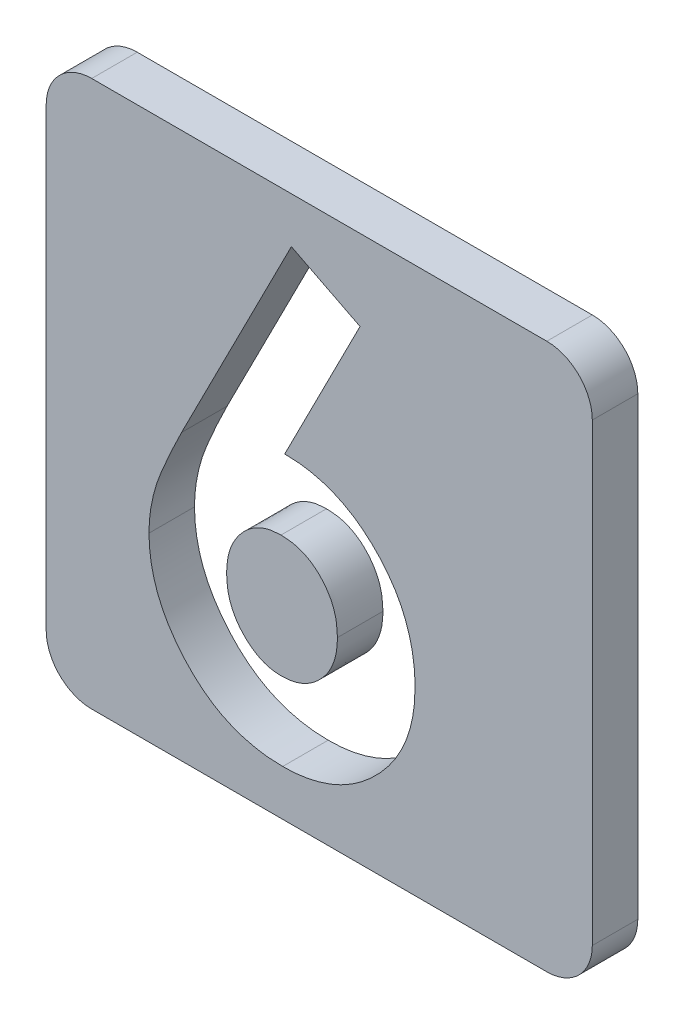
ISO-10303-21;
HEADER;
FILE_DESCRIPTION(('STEP AP214'),'2;1');
FILE_NAME('part.step','',(''),(''),'','','');
FILE_SCHEMA(('AUTOMOTIVE_DESIGN { 1 0 10303 214 1 1 1 1 }'));
ENDSEC;
DATA;
#1=APPLICATION_CONTEXT('core data for automotive mechanical design processes');
#2=APPLICATION_PROTOCOL_DEFINITION('international standard','automotive_design',2000,#1);
#3=PRODUCT_CONTEXT('',#1,'mechanical');
#4=PRODUCT('Part','Part','',(#3));
#5=PRODUCT_RELATED_PRODUCT_CATEGORY('part','',(#4));
#6=PRODUCT_DEFINITION_FORMATION('','',#4);
#7=PRODUCT_DEFINITION_CONTEXT('part definition',#1,'design');
#8=PRODUCT_DEFINITION('design','',#6,#7);
#9=PRODUCT_DEFINITION_SHAPE('','',#8);
#10=(LENGTH_UNIT() NAMED_UNIT(*) SI_UNIT(.MILLI.,.METRE.));
#11=(NAMED_UNIT(*) PLANE_ANGLE_UNIT() SI_UNIT($,.RADIAN.));
#12=(NAMED_UNIT(*) SI_UNIT($,.STERADIAN.) SOLID_ANGLE_UNIT());
#13=UNCERTAINTY_MEASURE_WITH_UNIT(LENGTH_MEASURE(1.E-05),#10,'distance_accuracy_value','');
#14=(GEOMETRIC_REPRESENTATION_CONTEXT(3) GLOBAL_UNCERTAINTY_ASSIGNED_CONTEXT((#13)) GLOBAL_UNIT_ASSIGNED_CONTEXT((#10,
#11,#12)) REPRESENTATION_CONTEXT('',''));
#15=CARTESIAN_POINT('',(0.,0.,0.));
#16=DIRECTION('',(0.,0.,1.));
#17=DIRECTION('',(1.,0.,0.));
#18=AXIS2_PLACEMENT_3D('',#15,#16,#17);
#19=CARTESIAN_POINT('',(50.,50.,10.));
#20=DIRECTION('',(0.,0.,-1.));
#21=DIRECTION('',(-1.,0.,0.));
#22=AXIS2_PLACEMENT_3D('',#19,#20,#21);
#23=PLANE('',#22);
#24=DIRECTION('',(1.,0.,0.));
#25=VECTOR('',#24,1.);
#26=CARTESIAN_POINT('',(-49.9999999999999,60.,10.));
#27=LINE('',#26,#25);
#28=CARTESIAN_POINT('',(-49.9999999999999,60.,10.));
#29=VERTEX_POINT('',#28);
#30=CARTESIAN_POINT('',(49.9999999999999,60.,10.));
#31=VERTEX_POINT('',#30);
#32=EDGE_CURVE('E280',#29,#31,#27,.T.);
#33=ORIENTED_EDGE('',*,*,#32,.F.);
#34=CARTESIAN_POINT('',(-50.,50.,10.));
#35=DIRECTION('',(0.,0.,1.));
#36=DIRECTION('',(1.,0.,0.));
#37=AXIS2_PLACEMENT_3D('',#34,#35,#36);
#38=CIRCLE('',#37,10.);
#39=CARTESIAN_POINT('',(-60.,49.9999999999999,10.));
#40=VERTEX_POINT('',#39);
#41=EDGE_CURVE('E301',#29,#40,#38,.T.);
#42=ORIENTED_EDGE('',*,*,#41,.T.);
#43=DIRECTION('',(0.,-1.,0.));
#44=VECTOR('',#43,1.);
#45=CARTESIAN_POINT('',(-60.,49.9999999999999,10.));
#46=LINE('',#45,#44);
#47=CARTESIAN_POINT('',(-60.,-49.9999999999999,10.));
#48=VERTEX_POINT('',#47);
#49=EDGE_CURVE('E299',#40,#48,#46,.T.);
#50=ORIENTED_EDGE('',*,*,#49,.T.);
#51=CARTESIAN_POINT('',(-50.,-50.,10.));
#52=DIRECTION('',(0.,0.,1.));
#53=DIRECTION('',(1.,0.,0.));
#54=AXIS2_PLACEMENT_3D('',#51,#52,#53);
#55=CIRCLE('',#54,10.);
#56=CARTESIAN_POINT('',(-49.9999999999999,-60.,10.));
#57=VERTEX_POINT('',#56);
#58=EDGE_CURVE('E297',#48,#57,#55,.T.);
#59=ORIENTED_EDGE('',*,*,#58,.T.);
#60=DIRECTION('',(1.,0.,0.));
#61=VECTOR('',#60,1.);
#62=CARTESIAN_POINT('',(-49.9999999999999,-60.,10.));
#63=LINE('',#62,#61);
#64=CARTESIAN_POINT('',(49.9999999999999,-60.,10.));
#65=VERTEX_POINT('',#64);
#66=EDGE_CURVE('E295',#57,#65,#63,.T.);
#67=ORIENTED_EDGE('',*,*,#66,.T.);
#68=CARTESIAN_POINT('',(50.,-50.,10.));
#69=DIRECTION('',(0.,0.,1.));
#70=DIRECTION('',(1.,0.,0.));
#71=AXIS2_PLACEMENT_3D('',#68,#69,#70);
#72=CIRCLE('',#71,10.);
#73=CARTESIAN_POINT('',(60.,-50.,10.));
#74=VERTEX_POINT('',#73);
#75=EDGE_CURVE('E186',#65,#74,#72,.T.);
#76=ORIENTED_EDGE('',*,*,#75,.T.);
#77=DIRECTION('',(0.,-1.,0.));
#78=VECTOR('',#77,1.);
#79=CARTESIAN_POINT('',(60.,49.9999999999999,10.));
#80=LINE('',#79,#78);
#81=CARTESIAN_POINT('',(60.,49.9999999999999,10.));
#82=VERTEX_POINT('',#81);
#83=EDGE_CURVE('E290',#82,#74,#80,.T.);
#84=ORIENTED_EDGE('',*,*,#83,.F.);
#85=CARTESIAN_POINT('',(50.,50.,10.));
#86=DIRECTION('',(0.,0.,-1.));
#87=DIRECTION('',(-1.,0.,0.));
#88=AXIS2_PLACEMENT_3D('',#85,#86,#87);
#89=CIRCLE('',#88,10.);
#90=EDGE_CURVE('E285',#31,#82,#89,.T.);
#91=ORIENTED_EDGE('',*,*,#90,.F.);
#92=EDGE_LOOP('',(#33,#42,#50,#59,#67,#76,#84,#91));
#93=FACE_BOUND('',#92,.T.);
#94=DIRECTION('',(0.45349711791017,0.891257742769828,0.));
#95=VECTOR('',#94,1.);
#96=CARTESIAN_POINT('',(-30.2548076923077,2.51201923076923,10.));
#97=LINE('',#96,#95);
#98=CARTESIAN_POINT('',(-30.2548076923077,2.51201923076923,10.));
#99=VERTEX_POINT('',#98);
#100=CARTESIAN_POINT('',(-6.12419871794871,49.9358974358974,10.));
#101=VERTEX_POINT('',#100);
#102=EDGE_CURVE('E99',#99,#101,#97,.T.);
#103=ORIENTED_EDGE('',*,*,#102,.T.);
#104=DIRECTION('',(0.891939015264469,-0.452155717700273,0.));
#105=VECTOR('',#104,1.);
#106=CARTESIAN_POINT('',(-6.12419871794871,49.9358974358974,10.));
#107=LINE('',#106,#105);
#108=CARTESIAN_POINT('',(8.96694711538462,42.2856570512821,10.));
#109=VERTEX_POINT('',#108);
#110=EDGE_CURVE('E89',#101,#109,#107,.T.);
#111=ORIENTED_EDGE('',*,*,#110,.T.);
#112=DIRECTION('',(-0.453457243720553,-0.891278030761086,0.));
#113=VECTOR('',#112,1.);
#114=CARTESIAN_POINT('',(8.96694711538462,42.2856570512821,10.));
#115=LINE('',#114,#113);
#116=CARTESIAN_POINT('',(-7.58954326923077,9.74358974358974,10.));
#117=VERTEX_POINT('',#116);
#118=EDGE_CURVE('E162',#109,#117,#115,.T.);
#119=ORIENTED_EDGE('',*,*,#118,.T.);
#120=CARTESIAN_POINT('',(-7.58954326923077,9.74358974358974,10.));
#121=CARTESIAN_POINT('',(-6.61140135303236,9.71826515612993,10.));
#122=CARTESIAN_POINT('',(-4.68479043816403,9.66838422800833,10.));
#123=CARTESIAN_POINT('',(-1.85017340666394,9.26523822641902,10.));
#124=CARTESIAN_POINT('',(0.859773239400669,8.56829545600975,10.));
#125=CARTESIAN_POINT('',(3.47237377647935,7.64449969903165,10.));
#126=CARTESIAN_POINT('',(5.95569163652655,6.40383282220985,10.));
#127=CARTESIAN_POINT('',(8.34972203649961,4.92799484719193,10.));
#128=CARTESIAN_POINT('',(10.5925302000025,3.12805169470289,10.));
#129=CARTESIAN_POINT('',(12.7355417979399,1.13381017847345,10.));
#130=CARTESIAN_POINT('',(14.6841712350539,-1.07552281475278,10.));
#131=CARTESIAN_POINT('',(16.3769004052369,-3.44952129980257,10.));
#132=CARTESIAN_POINT('',(17.8520839926872,-5.93042560310341,10.));
#133=CARTESIAN_POINT('',(18.9988323459456,-8.57373957331035,10.));
#134=CARTESIAN_POINT('',(19.9238377542154,-11.3356472749242,10.));
#135=CARTESIAN_POINT('',(20.5912698628496,-14.2271892414985,10.));
#136=CARTESIAN_POINT('',(20.9720585549099,-17.2567387400149,10.));
#137=CARTESIAN_POINT('',(21.0245566274761,-19.3148489477524,10.));
#138=CARTESIAN_POINT('',(21.0512820512821,-20.3625801282051,10.));
#139=B_SPLINE_CURVE_WITH_KNOTS('',3,(#120,#121,#122,#123,#124,#125,#126,#127,#128,#129,#130,
#131,#132,#133,#134,#135,#136,#137,#138),.UNSPECIFIED.,.F.,.F.,(4,1,1,1,1,1,1,1,1,1,1,1,1,1,1,1,
4),(0.,0.0633287933601148,0.124736444162658,0.184915748455891,0.244300408589092,
0.303825570582101,0.364352997673066,0.426073143672397,0.489720908838584,0.553755931535189,
0.616458062927627,0.6783188623543,0.740300940215084,0.80265626437734,0.866732122800169,
0.932156737880184,1.),.UNSPECIFIED.);
#140=CARTESIAN_POINT('',(21.0512820512821,-20.3625801282051,10.));
#141=VERTEX_POINT('',#140);
#142=EDGE_CURVE('E170',#117,#141,#139,.T.);
#143=ORIENTED_EDGE('',*,*,#142,.T.);
#144=CARTESIAN_POINT('',(21.0512820512821,-20.3625801282051,10.));
#145=CARTESIAN_POINT('',(21.0262381172069,-21.372529431284,10.));
#146=CARTESIAN_POINT('',(20.9767369988089,-23.3687661198865,10.));
#147=CARTESIAN_POINT('',(20.5675447255444,-26.3007301181485,10.));
#148=CARTESIAN_POINT('',(19.9062685156259,-29.1137781119858,10.));
#149=CARTESIAN_POINT('',(18.9611720214462,-31.8022920953617,10.));
#150=CARTESIAN_POINT('',(17.759877944846,-34.3794136007648,10.));
#151=CARTESIAN_POINT('',(16.2907766591292,-36.8436303495191,10.));
#152=CARTESIAN_POINT('',(14.5416848220925,-39.176528058408,10.));
#153=CARTESIAN_POINT('',(12.5577941278015,-41.3657108286592,10.));
#154=CARTESIAN_POINT('',(10.3890593564812,-43.3611671089008,10.));
#155=CARTESIAN_POINT('',(8.10309478339185,-45.1348447838939,10.));
#156=CARTESIAN_POINT('',(5.68052943114995,-46.5999698376945,10.));
#157=CARTESIAN_POINT('',(3.16715262129485,-47.8373022924508,10.));
#158=CARTESIAN_POINT('',(0.516691550466965,-48.7606203470328,10.));
#159=CARTESIAN_POINT('',(-2.23118950605615,-49.4575655280416,10.));
#160=CARTESIAN_POINT('',(-5.09732852187072,-49.8597331539674,10.));
#161=CARTESIAN_POINT('',(-7.04279025184823,-49.9103061884252,10.));
#162=CARTESIAN_POINT('',(-8.02724358974358,-49.9358974358974,10.));
#163=B_SPLINE_CURVE_WITH_KNOTS('',3,(#144,#145,#146,#147,#148,#149,#150,#151,#152,#153,#154,
#155,#156,#157,#158,#159,#160,#161,#162),.UNSPECIFIED.,.F.,.F.,(4,1,1,1,1,1,1,1,1,1,1,1,1,1,1,1,
4),(0.,0.0656209271532231,0.129704433602783,0.192008410051206,0.253165382518166,
0.314590013796294,0.376532773001164,0.439286701649034,0.50379852906577,0.568283999304001,
0.630628890742571,0.691512839647638,0.751997591162882,0.812376852071386,0.873576895280243,
0.936026679162742,1.),.UNSPECIFIED.);
#164=CARTESIAN_POINT('',(-8.02724358974358,-49.9358974358974,10.));
#165=VERTEX_POINT('',#164);
#166=EDGE_CURVE('E177',#141,#165,#163,.T.);
#167=ORIENTED_EDGE('',*,*,#166,.T.);
#168=CARTESIAN_POINT('',(-8.02724358974358,-49.9358974358974,10.));
#169=CARTESIAN_POINT('',(-9.05668261778942,-49.9148960570128,10.));
#170=CARTESIAN_POINT('',(-11.0809351780043,-49.8735996870316,10.));
#171=CARTESIAN_POINT('',(-14.0429232866212,-49.4111891814202,10.));
#172=CARTESIAN_POINT('',(-16.8837248053221,-48.715094627081,10.));
#173=CARTESIAN_POINT('',(-19.5873739707297,-47.7211898696775,10.));
#174=CARTESIAN_POINT('',(-22.1706839726894,-46.455640690833,10.));
#175=CARTESIAN_POINT('',(-24.6032409954527,-44.8896508677789,10.));
#176=CARTESIAN_POINT('',(-26.905535957799,-43.0404890761716,10.));
#177=CARTESIAN_POINT('',(-29.0530230330025,-40.9497585380829,10.));
#178=CARTESIAN_POINT('',(-30.9877488498369,-38.6596492903911,10.));
#179=CARTESIAN_POINT('',(-32.7133625764756,-36.2819196472673,10.));
#180=CARTESIAN_POINT('',(-34.1732340168066,-33.8128384231834,10.));
#181=CARTESIAN_POINT('',(-35.3549659173659,-31.2550455381416,10.));
#182=CARTESIAN_POINT('',(-36.2769805528079,-28.6166915143005,10.));
#183=CARTESIAN_POINT('',(-36.9185146877946,-25.8927689690469,10.));
#184=CARTESIAN_POINT('',(-37.3365333821673,-23.0905031069426,10.));
#185=CARTESIAN_POINT('',(-37.3855365381,-21.1887269176636,10.));
#186=CARTESIAN_POINT('',(-37.4102564102564,-20.2293669871795,10.));
#187=B_SPLINE_CURVE_WITH_KNOTS('',3,(#168,#169,#170,#171,#172,#173,#174,#175,#176,#177,#178,
#179,#180,#181,#182,#183,#184,#185,#186),.UNSPECIFIED.,.F.,.F.,(4,1,1,1,1,1,1,1,1,1,1,1,1,1,1,1,
4),(0.,0.0664859378748779,0.130735600938877,0.193286839504347,0.255291426706707,
0.316537602895467,0.378866710391164,0.441877206470673,0.50711749146645,0.572271391920337,
0.635427133538966,0.696817252457567,0.757356633381484,0.81726511683188,0.877134299459514,
0.938019820316455,1.),.UNSPECIFIED.);
#188=CARTESIAN_POINT('',(-37.4102564102564,-20.2293669871795,10.));
#189=VERTEX_POINT('',#188);
#190=EDGE_CURVE('E256',#165,#189,#187,.T.);
#191=ORIENTED_EDGE('',*,*,#190,.T.);
#192=CARTESIAN_POINT('',(-37.4102564102564,-20.2293669871795,10.));
#193=CARTESIAN_POINT('',(-37.3971949153571,-19.486454950031,10.));
#194=CARTESIAN_POINT('',(-37.3709992198972,-17.9964955212975,10.));
#195=CARTESIAN_POINT('',(-37.1077481405828,-15.7653622422438,10.));
#196=CARTESIAN_POINT('',(-36.7075140330156,-13.5283724490845,10.));
#197=CARTESIAN_POINT('',(-36.2435902987086,-11.640729627293,10.));
#198=CARTESIAN_POINT('',(-35.7658885058893,-10.0445300740634,10.));
#199=CARTESIAN_POINT('',(-35.2850779833052,-8.693709525369,10.));
#200=CARTESIAN_POINT('',(-34.689219280487,-7.19459408473303,10.));
#201=CARTESIAN_POINT('',(-34.0080645191852,-5.54335562028505,10.));
#202=CARTESIAN_POINT('',(-33.2201938613939,-3.74198056624347,10.));
#203=CARTESIAN_POINT('',(-32.3297230037422,-1.79537900180413,10.));
#204=CARTESIAN_POINT('',(-31.3344350688989,0.311190202493382,10.));
#205=CARTESIAN_POINT('',(-30.6246576908752,1.75807705534471,10.));
#206=CARTESIAN_POINT('',(-30.2548076923077,2.51201923076923,10.));
#207=B_SPLINE_CURVE_WITH_KNOTS('',3,(#192,#193,#194,#195,#196,#197,#198,#199,#200,#201,#202,
#203,#204,#205,#206),.UNSPECIFIED.,.F.,.F.,(4,1,1,1,1,1,1,1,1,1,1,1,4),(0.,0.0925378346593309,
0.185590773026734,0.279552479159953,0.375602295487676,0.427616715619481,0.487116870766556,
0.554198927807382,0.628623986024063,0.709687560518688,0.799180741828766,0.895357326611691,1.),.UNSPECIFIED.);
#208=EDGE_CURVE('E257',#189,#99,#207,.T.);
#209=ORIENTED_EDGE('',*,*,#208,.T.);
#210=EDGE_LOOP('',(#103,#111,#119,#143,#167,#191,#209));
#211=FACE_BOUND('',#210,.T.);
#212=ADVANCED_FACE('F43',(#93,#211),#23,.F.);
#213=CARTESIAN_POINT('',(50.,50.,0.));
#214=DIRECTION('',(0.,0.,-1.));
#215=DIRECTION('',(-1.,0.,0.));
#216=AXIS2_PLACEMENT_3D('',#213,#214,#215);
#217=PLANE('',#216);
#218=DIRECTION('',(1.,0.,0.));
#219=VECTOR('',#218,1.);
#220=CARTESIAN_POINT('',(-49.9999999999999,60.,0.));
#221=LINE('',#220,#219);
#222=CARTESIAN_POINT('',(-49.9999999999999,60.,0.));
#223=VERTEX_POINT('',#222);
#224=CARTESIAN_POINT('',(49.9999999999999,60.,0.));
#225=VERTEX_POINT('',#224);
#226=EDGE_CURVE('E223',#223,#225,#221,.T.);
#227=ORIENTED_EDGE('',*,*,#226,.T.);
#228=CARTESIAN_POINT('',(50.,50.,0.));
#229=DIRECTION('',(0.,0.,-1.));
#230=DIRECTION('',(-1.,0.,0.));
#231=AXIS2_PLACEMENT_3D('',#228,#229,#230);
#232=CIRCLE('',#231,10.);
#233=CARTESIAN_POINT('',(60.,49.9999999999999,0.));
#234=VERTEX_POINT('',#233);
#235=EDGE_CURVE('E304',#225,#234,#232,.T.);
#236=ORIENTED_EDGE('',*,*,#235,.T.);
#237=DIRECTION('',(0.,-1.,0.));
#238=VECTOR('',#237,1.);
#239=CARTESIAN_POINT('',(60.,49.9999999999999,0.));
#240=LINE('',#239,#238);
#241=CARTESIAN_POINT('',(60.,-50.,0.));
#242=VERTEX_POINT('',#241);
#243=EDGE_CURVE('E284',#234,#242,#240,.T.);
#244=ORIENTED_EDGE('',*,*,#243,.T.);
#245=CARTESIAN_POINT('',(50.,-50.,0.));
#246=DIRECTION('',(0.,0.,1.));
#247=DIRECTION('',(1.,0.,0.));
#248=AXIS2_PLACEMENT_3D('',#245,#246,#247);
#249=CIRCLE('',#248,10.);
#250=CARTESIAN_POINT('',(49.9999999999999,-60.,0.));
#251=VERTEX_POINT('',#250);
#252=EDGE_CURVE('E308',#251,#242,#249,.T.);
#253=ORIENTED_EDGE('',*,*,#252,.F.);
#254=DIRECTION('',(1.,0.,0.));
#255=VECTOR('',#254,1.);
#256=CARTESIAN_POINT('',(-49.9999999999999,-60.,0.));
#257=LINE('',#256,#255);
#258=CARTESIAN_POINT('',(-49.9999999999999,-60.,0.));
#259=VERTEX_POINT('',#258);
#260=EDGE_CURVE('E312',#259,#251,#257,.T.);
#261=ORIENTED_EDGE('',*,*,#260,.F.);
#262=CARTESIAN_POINT('',(-50.,-50.,0.));
#263=DIRECTION('',(0.,0.,1.));
#264=DIRECTION('',(1.,0.,0.));
#265=AXIS2_PLACEMENT_3D('',#262,#263,#264);
#266=CIRCLE('',#265,10.);
#267=CARTESIAN_POINT('',(-60.,-49.9999999999999,0.));
#268=VERTEX_POINT('',#267);
#269=EDGE_CURVE('E315',#268,#259,#266,.T.);
#270=ORIENTED_EDGE('',*,*,#269,.F.);
#271=DIRECTION('',(0.,-1.,0.));
#272=VECTOR('',#271,1.);
#273=CARTESIAN_POINT('',(-60.,49.9999999999999,0.));
#274=LINE('',#273,#272);
#275=CARTESIAN_POINT('',(-60.,49.9999999999999,0.));
#276=VERTEX_POINT('',#275);
#277=EDGE_CURVE('E318',#276,#268,#274,.T.);
#278=ORIENTED_EDGE('',*,*,#277,.F.);
#279=CARTESIAN_POINT('',(-50.,50.,0.));
#280=DIRECTION('',(0.,0.,1.));
#281=DIRECTION('',(1.,0.,0.));
#282=AXIS2_PLACEMENT_3D('',#279,#280,#281);
#283=CIRCLE('',#282,10.);
#284=EDGE_CURVE('E321',#223,#276,#283,.T.);
#285=ORIENTED_EDGE('',*,*,#284,.F.);
#286=EDGE_LOOP('',(#227,#236,#244,#253,#261,#270,#278,#285));
#287=FACE_BOUND('',#286,.T.);
#288=DIRECTION('',(0.891939015264469,-0.452155717700273,0.));
#289=VECTOR('',#288,1.);
#290=CARTESIAN_POINT('',(-6.12419871794871,49.9358974358974,0.));
#291=LINE('',#290,#289);
#292=CARTESIAN_POINT('',(-6.12419871794871,49.9358974358974,0.));
#293=VERTEX_POINT('',#292);
#294=CARTESIAN_POINT('',(8.96694711538462,42.2856570512821,0.));
#295=VERTEX_POINT('',#294);
#296=EDGE_CURVE('E85',#293,#295,#291,.T.);
#297=ORIENTED_EDGE('',*,*,#296,.F.);
#298=DIRECTION('',(0.45349711791017,0.891257742769828,0.));
#299=VECTOR('',#298,1.);
#300=CARTESIAN_POINT('',(-30.2548076923077,2.51201923076923,0.));
#301=LINE('',#300,#299);
#302=CARTESIAN_POINT('',(-30.2548076923077,2.51201923076923,0.));
#303=VERTEX_POINT('',#302);
#304=EDGE_CURVE('E46',#303,#293,#301,.T.);
#305=ORIENTED_EDGE('',*,*,#304,.F.);
#306=CARTESIAN_POINT('',(-37.4102564102564,-20.2293669871795,0.));
#307=CARTESIAN_POINT('',(-37.3971949153571,-19.486454950031,0.));
#308=CARTESIAN_POINT('',(-37.3709992198972,-17.9964955212975,0.));
#309=CARTESIAN_POINT('',(-37.1077481405828,-15.7653622422438,0.));
#310=CARTESIAN_POINT('',(-36.7075140330156,-13.5283724490845,0.));
#311=CARTESIAN_POINT('',(-36.2435902987086,-11.640729627293,0.));
#312=CARTESIAN_POINT('',(-35.7658885058893,-10.0445300740634,0.));
#313=CARTESIAN_POINT('',(-35.2850779833052,-8.693709525369,0.));
#314=CARTESIAN_POINT('',(-34.689219280487,-7.19459408473303,0.));
#315=CARTESIAN_POINT('',(-34.0080645191852,-5.54335562028505,0.));
#316=CARTESIAN_POINT('',(-33.2201938613939,-3.74198056624347,0.));
#317=CARTESIAN_POINT('',(-32.3297230037422,-1.79537900180413,0.));
#318=CARTESIAN_POINT('',(-31.3344350688989,0.311190202493382,0.));
#319=CARTESIAN_POINT('',(-30.6246576908752,1.75807705534471,0.));
#320=CARTESIAN_POINT('',(-30.2548076923077,2.51201923076923,0.));
#321=B_SPLINE_CURVE_WITH_KNOTS('',3,(#306,#307,#308,#309,#310,#311,#312,#313,#314,#315,#316,
#317,#318,#319,#320),.UNSPECIFIED.,.F.,.F.,(4,1,1,1,1,1,1,1,1,1,1,1,4),(0.,0.0925378346593309,
0.185590773026734,0.279552479159953,0.375602295487676,0.427616715619481,0.487116870766556,
0.554198927807382,0.628623986024063,0.709687560518688,0.799180741828766,0.895357326611691,1.),.UNSPECIFIED.);
#322=CARTESIAN_POINT('',(-37.4102564102564,-20.2293669871795,0.));
#323=VERTEX_POINT('',#322);
#324=EDGE_CURVE('E52',#323,#303,#321,.T.);
#325=ORIENTED_EDGE('',*,*,#324,.F.);
#326=CARTESIAN_POINT('',(-8.02724358974358,-49.9358974358974,0.));
#327=CARTESIAN_POINT('',(-9.05668261778942,-49.9148960570128,0.));
#328=CARTESIAN_POINT('',(-11.0809351780043,-49.8735996870316,0.));
#329=CARTESIAN_POINT('',(-14.0429232866212,-49.4111891814202,0.));
#330=CARTESIAN_POINT('',(-16.8837248053221,-48.715094627081,0.));
#331=CARTESIAN_POINT('',(-19.5873739707297,-47.7211898696775,0.));
#332=CARTESIAN_POINT('',(-22.1706839726894,-46.455640690833,0.));
#333=CARTESIAN_POINT('',(-24.6032409954527,-44.8896508677789,0.));
#334=CARTESIAN_POINT('',(-26.905535957799,-43.0404890761716,0.));
#335=CARTESIAN_POINT('',(-29.0530230330025,-40.9497585380829,0.));
#336=CARTESIAN_POINT('',(-30.9877488498369,-38.6596492903911,0.));
#337=CARTESIAN_POINT('',(-32.7133625764756,-36.2819196472673,0.));
#338=CARTESIAN_POINT('',(-34.1732340168066,-33.8128384231834,0.));
#339=CARTESIAN_POINT('',(-35.3549659173659,-31.2550455381416,0.));
#340=CARTESIAN_POINT('',(-36.2769805528079,-28.6166915143005,0.));
#341=CARTESIAN_POINT('',(-36.9185146877946,-25.8927689690469,0.));
#342=CARTESIAN_POINT('',(-37.3365333821673,-23.0905031069426,0.));
#343=CARTESIAN_POINT('',(-37.3855365381,-21.1887269176636,0.));
#344=CARTESIAN_POINT('',(-37.4102564102564,-20.2293669871795,0.));
#345=B_SPLINE_CURVE_WITH_KNOTS('',3,(#326,#327,#328,#329,#330,#331,#332,#333,#334,#335,#336,
#337,#338,#339,#340,#341,#342,#343,#344),.UNSPECIFIED.,.F.,.F.,(4,1,1,1,1,1,1,1,1,1,1,1,1,1,1,1,
4),(0.,0.0664859378748779,0.130735600938877,0.193286839504347,0.255291426706707,
0.316537602895467,0.378866710391164,0.441877206470673,0.50711749146645,0.572271391920337,
0.635427133538966,0.696817252457567,0.757356633381484,0.81726511683188,0.877134299459514,
0.938019820316455,1.),.UNSPECIFIED.);
#346=CARTESIAN_POINT('',(-8.02724358974358,-49.9358974358974,0.));
#347=VERTEX_POINT('',#346);
#348=EDGE_CURVE('E192',#347,#323,#345,.T.);
#349=ORIENTED_EDGE('',*,*,#348,.F.);
#350=CARTESIAN_POINT('',(21.0512820512821,-20.3625801282051,0.));
#351=CARTESIAN_POINT('',(21.0262381172069,-21.372529431284,0.));
#352=CARTESIAN_POINT('',(20.9767369988089,-23.3687661198865,0.));
#353=CARTESIAN_POINT('',(20.5675447255444,-26.3007301181485,0.));
#354=CARTESIAN_POINT('',(19.9062685156259,-29.1137781119858,0.));
#355=CARTESIAN_POINT('',(18.9611720214462,-31.8022920953617,0.));
#356=CARTESIAN_POINT('',(17.759877944846,-34.3794136007648,0.));
#357=CARTESIAN_POINT('',(16.2907766591292,-36.8436303495191,0.));
#358=CARTESIAN_POINT('',(14.5416848220925,-39.176528058408,0.));
#359=CARTESIAN_POINT('',(12.5577941278015,-41.3657108286592,0.));
#360=CARTESIAN_POINT('',(10.3890593564812,-43.3611671089008,0.));
#361=CARTESIAN_POINT('',(8.10309478339185,-45.1348447838939,0.));
#362=CARTESIAN_POINT('',(5.68052943114995,-46.5999698376945,0.));
#363=CARTESIAN_POINT('',(3.16715262129485,-47.8373022924508,0.));
#364=CARTESIAN_POINT('',(0.516691550466965,-48.7606203470328,0.));
#365=CARTESIAN_POINT('',(-2.23118950605615,-49.4575655280416,0.));
#366=CARTESIAN_POINT('',(-5.09732852187072,-49.8597331539674,0.));
#367=CARTESIAN_POINT('',(-7.04279025184823,-49.9103061884252,0.));
#368=CARTESIAN_POINT('',(-8.02724358974358,-49.9358974358974,0.));
#369=B_SPLINE_CURVE_WITH_KNOTS('',3,(#350,#351,#352,#353,#354,#355,#356,#357,#358,#359,#360,
#361,#362,#363,#364,#365,#366,#367,#368),.UNSPECIFIED.,.F.,.F.,(4,1,1,1,1,1,1,1,1,1,1,1,1,1,1,1,
4),(0.,0.0656209271532231,0.129704433602783,0.192008410051206,0.253165382518166,
0.314590013796294,0.376532773001164,0.439286701649034,0.50379852906577,0.568283999304001,
0.630628890742571,0.691512839647638,0.751997591162882,0.812376852071386,0.873576895280243,
0.936026679162742,1.),.UNSPECIFIED.);
#370=CARTESIAN_POINT('',(21.0512820512821,-20.3625801282051,0.));
#371=VERTEX_POINT('',#370);
#372=EDGE_CURVE('E233',#371,#347,#369,.T.);
#373=ORIENTED_EDGE('',*,*,#372,.F.);
#374=CARTESIAN_POINT('',(-7.58954326923077,9.74358974358974,0.));
#375=CARTESIAN_POINT('',(-6.61140135303236,9.71826515612993,0.));
#376=CARTESIAN_POINT('',(-4.68479043816403,9.66838422800833,0.));
#377=CARTESIAN_POINT('',(-1.85017340666394,9.26523822641902,0.));
#378=CARTESIAN_POINT('',(0.859773239400669,8.56829545600975,0.));
#379=CARTESIAN_POINT('',(3.47237377647935,7.64449969903165,0.));
#380=CARTESIAN_POINT('',(5.95569163652655,6.40383282220985,0.));
#381=CARTESIAN_POINT('',(8.34972203649961,4.92799484719193,0.));
#382=CARTESIAN_POINT('',(10.5925302000025,3.12805169470289,0.));
#383=CARTESIAN_POINT('',(12.7355417979399,1.13381017847345,0.));
#384=CARTESIAN_POINT('',(14.6841712350539,-1.07552281475278,0.));
#385=CARTESIAN_POINT('',(16.3769004052369,-3.44952129980257,0.));
#386=CARTESIAN_POINT('',(17.8520839926872,-5.93042560310341,0.));
#387=CARTESIAN_POINT('',(18.9988323459456,-8.57373957331035,0.));
#388=CARTESIAN_POINT('',(19.9238377542154,-11.3356472749242,0.));
#389=CARTESIAN_POINT('',(20.5912698628496,-14.2271892414985,0.));
#390=CARTESIAN_POINT('',(20.9720585549099,-17.2567387400149,0.));
#391=CARTESIAN_POINT('',(21.0245566274761,-19.3148489477524,0.));
#392=CARTESIAN_POINT('',(21.0512820512821,-20.3625801282051,0.));
#393=B_SPLINE_CURVE_WITH_KNOTS('',3,(#374,#375,#376,#377,#378,#379,#380,#381,#382,#383,#384,
#385,#386,#387,#388,#389,#390,#391,#392),.UNSPECIFIED.,.F.,.F.,(4,1,1,1,1,1,1,1,1,1,1,1,1,1,1,1,
4),(0.,0.0633287933601148,0.124736444162658,0.184915748455891,0.244300408589092,
0.303825570582101,0.364352997673066,0.426073143672397,0.489720908838584,0.553755931535189,
0.616458062927627,0.6783188623543,0.740300940215084,0.80265626437734,0.866732122800169,
0.932156737880184,1.),.UNSPECIFIED.);
#394=CARTESIAN_POINT('',(-7.58954326923077,9.74358974358974,0.));
#395=VERTEX_POINT('',#394);
#396=EDGE_CURVE('E167',#395,#371,#393,.T.);
#397=ORIENTED_EDGE('',*,*,#396,.F.);
#398=DIRECTION('',(-0.453457243720553,-0.891278030761086,0.));
#399=VECTOR('',#398,1.);
#400=CARTESIAN_POINT('',(8.96694711538462,42.2856570512821,0.));
#401=LINE('',#400,#399);
#402=EDGE_CURVE('E164',#295,#395,#401,.T.);
#403=ORIENTED_EDGE('',*,*,#402,.F.);
#404=EDGE_LOOP('',(#297,#305,#325,#349,#373,#397,#403));
#405=FACE_BOUND('',#404,.T.);
#406=ADVANCED_FACE('F206',(#287,#405),#217,.T.);
#407=CARTESIAN_POINT('',(-49.9999999999999,60.,10.));
#408=DIRECTION('',(0.,1.,0.));
#409=DIRECTION('',(0.,0.,1.));
#410=AXIS2_PLACEMENT_3D('',#407,#408,#409);
#411=PLANE('',#410);
#412=ORIENTED_EDGE('',*,*,#226,.F.);
#413=DIRECTION('',(0.,0.,-1.));
#414=VECTOR('',#413,1.);
#415=CARTESIAN_POINT('',(-49.9999999999999,60.,10.));
#416=LINE('',#415,#414);
#417=EDGE_CURVE('E320',#29,#223,#416,.T.);
#418=ORIENTED_EDGE('',*,*,#417,.F.);
#419=ORIENTED_EDGE('',*,*,#32,.T.);
#420=DIRECTION('',(0.,0.,-1.));
#421=VECTOR('',#420,1.);
#422=CARTESIAN_POINT('',(49.9999999999999,60.,10.));
#423=LINE('',#422,#421);
#424=EDGE_CURVE('E283',#31,#225,#423,.T.);
#425=ORIENTED_EDGE('',*,*,#424,.T.);
#426=EDGE_LOOP('',(#412,#418,#419,#425));
#427=FACE_BOUND('',#426,.T.);
#428=ADVANCED_FACE('F208',(#427),#411,.T.);
#429=CARTESIAN_POINT('',(-50.,50.,10.));
#430=DIRECTION('',(0.,0.,-1.));
#431=DIRECTION('',(-1.,0.,0.));
#432=AXIS2_PLACEMENT_3D('',#429,#430,#431);
#433=CYLINDRICAL_SURFACE('',#432,10.);
#434=ORIENTED_EDGE('',*,*,#284,.T.);
#435=DIRECTION('',(0.,0.,-1.));
#436=VECTOR('',#435,1.);
#437=CARTESIAN_POINT('',(-60.,49.9999999999999,10.));
#438=LINE('',#437,#436);
#439=EDGE_CURVE('E317',#40,#276,#438,.T.);
#440=ORIENTED_EDGE('',*,*,#439,.F.);
#441=ORIENTED_EDGE('',*,*,#41,.F.);
#442=ORIENTED_EDGE('',*,*,#417,.T.);
#443=EDGE_LOOP('',(#434,#440,#441,#442));
#444=FACE_BOUND('',#443,.T.);
#445=ADVANCED_FACE('F214',(#444),#433,.T.);
#446=CARTESIAN_POINT('',(-60.,49.9999999999999,10.));
#447=DIRECTION('',(1.,0.,0.));
#448=DIRECTION('',(0.,1.,0.));
#449=AXIS2_PLACEMENT_3D('',#446,#447,#448);
#450=PLANE('',#449);
#451=ORIENTED_EDGE('',*,*,#277,.T.);
#452=DIRECTION('',(0.,0.,-1.));
#453=VECTOR('',#452,1.);
#454=CARTESIAN_POINT('',(-60.,-49.9999999999999,10.));
#455=LINE('',#454,#453);
#456=EDGE_CURVE('E314',#48,#268,#455,.T.);
#457=ORIENTED_EDGE('',*,*,#456,.F.);
#458=ORIENTED_EDGE('',*,*,#49,.F.);
#459=ORIENTED_EDGE('',*,*,#439,.T.);
#460=EDGE_LOOP('',(#451,#457,#458,#459));
#461=FACE_BOUND('',#460,.T.);
#462=ADVANCED_FACE('F362',(#461),#450,.F.);
#463=CARTESIAN_POINT('',(-50.,-50.,10.));
#464=DIRECTION('',(0.,0.,-1.));
#465=DIRECTION('',(-1.,0.,0.));
#466=AXIS2_PLACEMENT_3D('',#463,#464,#465);
#467=CYLINDRICAL_SURFACE('',#466,10.);
#468=ORIENTED_EDGE('',*,*,#269,.T.);
#469=DIRECTION('',(0.,0.,-1.));
#470=VECTOR('',#469,1.);
#471=CARTESIAN_POINT('',(-49.9999999999999,-60.,10.));
#472=LINE('',#471,#470);
#473=EDGE_CURVE('E311',#57,#259,#472,.T.);
#474=ORIENTED_EDGE('',*,*,#473,.F.);
#475=ORIENTED_EDGE('',*,*,#58,.F.);
#476=ORIENTED_EDGE('',*,*,#456,.T.);
#477=EDGE_LOOP('',(#468,#474,#475,#476));
#478=FACE_BOUND('',#477,.T.);
#479=ADVANCED_FACE('F357',(#478),#467,.T.);
#480=CARTESIAN_POINT('',(-49.9999999999999,-60.,10.));
#481=DIRECTION('',(0.,1.,0.));
#482=DIRECTION('',(0.,0.,1.));
#483=AXIS2_PLACEMENT_3D('',#480,#481,#482);
#484=PLANE('',#483);
#485=ORIENTED_EDGE('',*,*,#260,.T.);
#486=DIRECTION('',(0.,0.,-1.));
#487=VECTOR('',#486,1.);
#488=CARTESIAN_POINT('',(49.9999999999999,-60.,10.));
#489=LINE('',#488,#487);
#490=EDGE_CURVE('E293',#65,#251,#489,.T.);
#491=ORIENTED_EDGE('',*,*,#490,.F.);
#492=ORIENTED_EDGE('',*,*,#66,.F.);
#493=ORIENTED_EDGE('',*,*,#473,.T.);
#494=EDGE_LOOP('',(#485,#491,#492,#493));
#495=FACE_BOUND('',#494,.T.);
#496=ADVANCED_FACE('F352',(#495),#484,.F.);
#497=CARTESIAN_POINT('',(50.,-50.,10.));
#498=DIRECTION('',(0.,0.,-1.));
#499=DIRECTION('',(-1.,0.,0.));
#500=AXIS2_PLACEMENT_3D('',#497,#498,#499);
#501=CYLINDRICAL_SURFACE('',#500,10.);
#502=ORIENTED_EDGE('',*,*,#252,.T.);
#503=DIRECTION('',(0.,0.,-1.));
#504=VECTOR('',#503,1.);
#505=CARTESIAN_POINT('',(60.,-50.,10.));
#506=LINE('',#505,#504);
#507=EDGE_CURVE('E289',#74,#242,#506,.T.);
#508=ORIENTED_EDGE('',*,*,#507,.F.);
#509=ORIENTED_EDGE('',*,*,#75,.F.);
#510=ORIENTED_EDGE('',*,*,#490,.T.);
#511=EDGE_LOOP('',(#502,#508,#509,#510));
#512=FACE_BOUND('',#511,.T.);
#513=ADVANCED_FACE('F348',(#512),#501,.T.);
#514=CARTESIAN_POINT('',(60.,49.9999999999999,10.));
#515=DIRECTION('',(1.,0.,0.));
#516=DIRECTION('',(0.,1.,0.));
#517=AXIS2_PLACEMENT_3D('',#514,#515,#516);
#518=PLANE('',#517);
#519=ORIENTED_EDGE('',*,*,#243,.F.);
#520=DIRECTION('',(0.,0.,-1.));
#521=VECTOR('',#520,1.);
#522=CARTESIAN_POINT('',(60.,49.9999999999999,10.));
#523=LINE('',#522,#521);
#524=EDGE_CURVE('E288',#82,#234,#523,.T.);
#525=ORIENTED_EDGE('',*,*,#524,.F.);
#526=ORIENTED_EDGE('',*,*,#83,.T.);
#527=ORIENTED_EDGE('',*,*,#507,.T.);
#528=EDGE_LOOP('',(#519,#525,#526,#527));
#529=FACE_BOUND('',#528,.T.);
#530=ADVANCED_FACE('F343',(#529),#518,.T.);
#531=CARTESIAN_POINT('',(50.,50.,10.));
#532=DIRECTION('',(0.,0.,-1.));
#533=DIRECTION('',(-1.,0.,0.));
#534=AXIS2_PLACEMENT_3D('',#531,#532,#533);
#535=CYLINDRICAL_SURFACE('',#534,10.);
#536=ORIENTED_EDGE('',*,*,#235,.F.);
#537=ORIENTED_EDGE('',*,*,#424,.F.);
#538=ORIENTED_EDGE('',*,*,#90,.T.);
#539=ORIENTED_EDGE('',*,*,#524,.T.);
#540=EDGE_LOOP('',(#536,#537,#538,#539));
#541=FACE_BOUND('',#540,.T.);
#542=ADVANCED_FACE('F338',(#541),#535,.T.);
#543=CARTESIAN_POINT('',(-30.2548076923077,2.51201923076923,0.));
#544=DIRECTION('',(0.891257742769828,-0.45349711791017,0.));
#545=DIRECTION('',(0.45349711791017,0.891257742769828,0.));
#546=AXIS2_PLACEMENT_3D('',#543,#544,#545);
#547=PLANE('',#546);
#548=ORIENTED_EDGE('',*,*,#102,.F.);
#549=DIRECTION('',(0.,0.,1.));
#550=VECTOR('',#549,1.);
#551=CARTESIAN_POINT('',(-30.2548076923077,2.51201923076923,0.));
#552=LINE('',#551,#550);
#553=EDGE_CURVE('E12',#303,#99,#552,.T.);
#554=ORIENTED_EDGE('',*,*,#553,.F.);
#555=ORIENTED_EDGE('',*,*,#304,.T.);
#556=DIRECTION('',(0.,0.,1.));
#557=VECTOR('',#556,1.);
#558=CARTESIAN_POINT('',(-6.12419871794871,49.9358974358974,0.));
#559=LINE('',#558,#557);
#560=EDGE_CURVE('E225',#293,#101,#559,.T.);
#561=ORIENTED_EDGE('',*,*,#560,.T.);
#562=EDGE_LOOP('',(#548,#554,#555,#561));
#563=FACE_BOUND('',#562,.T.);
#564=ADVANCED_FACE('F374',(#563),#547,.T.);
#565=CARTESIAN_POINT('',(-6.12419871794871,49.9358974358974,0.));
#566=DIRECTION('',(-0.452155717700273,-0.891939015264469,0.));
#567=DIRECTION('',(0.891939015264469,-0.452155717700273,0.));
#568=AXIS2_PLACEMENT_3D('',#565,#566,#567);
#569=PLANE('',#568);
#570=ORIENTED_EDGE('',*,*,#110,.F.);
#571=ORIENTED_EDGE('',*,*,#560,.F.);
#572=ORIENTED_EDGE('',*,*,#296,.T.);
#573=DIRECTION('',(0.,0.,1.));
#574=VECTOR('',#573,1.);
#575=CARTESIAN_POINT('',(8.96694711538462,42.2856570512821,0.));
#576=LINE('',#575,#574);
#577=EDGE_CURVE('E224',#295,#109,#576,.T.);
#578=ORIENTED_EDGE('',*,*,#577,.T.);
#579=EDGE_LOOP('',(#570,#571,#572,#578));
#580=FACE_BOUND('',#579,.T.);
#581=ADVANCED_FACE('F376',(#580),#569,.T.);
#582=CARTESIAN_POINT('',(8.96694711538462,42.2856570512821,0.));
#583=DIRECTION('',(-0.891278030761086,0.453457243720553,0.));
#584=DIRECTION('',(-0.453457243720553,-0.891278030761086,0.));
#585=AXIS2_PLACEMENT_3D('',#582,#583,#584);
#586=PLANE('',#585);
#587=ORIENTED_EDGE('',*,*,#118,.F.);
#588=ORIENTED_EDGE('',*,*,#577,.F.);
#589=ORIENTED_EDGE('',*,*,#402,.T.);
#590=DIRECTION('',(0.,0.,1.));
#591=VECTOR('',#590,1.);
#592=CARTESIAN_POINT('',(-7.58954326923077,9.74358974358974,0.));
#593=LINE('',#592,#591);
#594=EDGE_CURVE('E158',#395,#117,#593,.T.);
#595=ORIENTED_EDGE('',*,*,#594,.T.);
#596=EDGE_LOOP('',(#587,#588,#589,#595));
#597=FACE_BOUND('',#596,.T.);
#598=ADVANCED_FACE('F160',(#597),#586,.T.);
#599=DIRECTION('',(0.,0.,1.));
#600=VECTOR('',#599,1.);
#601=SURFACE_OF_LINEAR_EXTRUSION('',#393,#600);
#602=ORIENTED_EDGE('',*,*,#142,.F.);
#603=ORIENTED_EDGE('',*,*,#594,.F.);
#604=ORIENTED_EDGE('',*,*,#396,.T.);
#605=DIRECTION('',(0.,0.,1.));
#606=VECTOR('',#605,1.);
#607=CARTESIAN_POINT('',(21.0512820512821,-20.3625801282051,0.));
#608=LINE('',#607,#606);
#609=EDGE_CURVE('E173',#371,#141,#608,.T.);
#610=ORIENTED_EDGE('',*,*,#609,.T.);
#611=EDGE_LOOP('',(#602,#603,#604,#610));
#612=FACE_BOUND('',#611,.T.);
#613=ADVANCED_FACE('F171',(#612),#601,.T.);
#614=DIRECTION('',(0.,0.,1.));
#615=VECTOR('',#614,1.);
#616=SURFACE_OF_LINEAR_EXTRUSION('',#369,#615);
#617=ORIENTED_EDGE('',*,*,#166,.F.);
#618=ORIENTED_EDGE('',*,*,#609,.F.);
#619=ORIENTED_EDGE('',*,*,#372,.T.);
#620=DIRECTION('',(0.,0.,1.));
#621=VECTOR('',#620,1.);
#622=CARTESIAN_POINT('',(-8.02724358974358,-49.9358974358974,0.));
#623=LINE('',#622,#621);
#624=EDGE_CURVE('E253',#347,#165,#623,.T.);
#625=ORIENTED_EDGE('',*,*,#624,.T.);
#626=EDGE_LOOP('',(#617,#618,#619,#625));
#627=FACE_BOUND('',#626,.T.);
#628=ADVANCED_FACE('F243',(#627),#616,.T.);
#629=DIRECTION('',(0.,0.,1.));
#630=VECTOR('',#629,1.);
#631=SURFACE_OF_LINEAR_EXTRUSION('',#345,#630);
#632=ORIENTED_EDGE('',*,*,#190,.F.);
#633=ORIENTED_EDGE('',*,*,#624,.F.);
#634=ORIENTED_EDGE('',*,*,#348,.T.);
#635=DIRECTION('',(0.,0.,1.));
#636=VECTOR('',#635,1.);
#637=CARTESIAN_POINT('',(-37.4102564102564,-20.2293669871795,0.));
#638=LINE('',#637,#636);
#639=EDGE_CURVE('E191',#323,#189,#638,.T.);
#640=ORIENTED_EDGE('',*,*,#639,.T.);
#641=EDGE_LOOP('',(#632,#633,#634,#640));
#642=FACE_BOUND('',#641,.T.);
#643=ADVANCED_FACE('F204',(#642),#631,.T.);
#644=DIRECTION('',(0.,0.,1.));
#645=VECTOR('',#644,1.);
#646=SURFACE_OF_LINEAR_EXTRUSION('',#321,#645);
#647=ORIENTED_EDGE('',*,*,#208,.F.);
#648=ORIENTED_EDGE('',*,*,#639,.F.);
#649=ORIENTED_EDGE('',*,*,#324,.T.);
#650=ORIENTED_EDGE('',*,*,#553,.T.);
#651=EDGE_LOOP('',(#647,#648,#649,#650));
#652=FACE_BOUND('',#651,.T.);
#653=ADVANCED_FACE('F201',(#652),#646,.T.);
#654=CLOSED_SHELL('',(#212,#406,#428,#445,#462,#479,#496,#513,#530,#542,#564,#581,#598,#613,
#628,#643,#653));
#655=MANIFOLD_SOLID_BREP('B2',#654);
#656=CARTESIAN_POINT('',(50.,50.,0.));
#657=DIRECTION('',(0.,0.,-1.));
#658=DIRECTION('',(-1.,0.,0.));
#659=AXIS2_PLACEMENT_3D('',#656,#657,#658);
#660=PLANE('',#659);
#661=CARTESIAN_POINT('',(-8.40785256410256,-6.08974358974359,0.));
#662=CARTESIAN_POINT('',(-9.22602497367395,-6.127271429445,0.));
#663=CARTESIAN_POINT('',(-10.8270809807157,-6.20070848559886,0.));
#664=CARTESIAN_POINT('',(-13.103543183775,-6.96977708811534,0.));
#665=CARTESIAN_POINT('',(-15.1791602160784,-8.17625431666314,0.));
#666=CARTESIAN_POINT('',(-16.9783307308391,-9.85650718095623,0.));
#667=CARTESIAN_POINT('',(-18.4831713195563,-11.8644753348237,0.));
#668=CARTESIAN_POINT('',(-19.5889809827941,-14.1548312244393,0.));
#669=CARTESIAN_POINT('',(-20.254186954308,-16.6970106791691,0.));
#670=CARTESIAN_POINT('',(-20.3232975942305,-18.4744601728564,0.));
#671=CARTESIAN_POINT('',(-20.3589743589744,-19.3920272435897,0.));
#672=B_SPLINE_CURVE_WITH_KNOTS('',3,(#661,#662,#663,#664,#665,#666,#667,#668,#669,#670,#671),
.UNSPECIFIED.,.F.,.F.,(4,1,1,1,1,1,1,1,4),(0.,0.12271805150397,0.240143118045029,
0.357362376510216,0.481673852464946,0.607865828799598,0.732955480675019,0.862144461362948,1.),.UNSPECIFIED.);
#673=CARTESIAN_POINT('',(-8.40785256410256,-6.08974358974359,0.));
#674=VERTEX_POINT('',#673);
#675=CARTESIAN_POINT('',(-20.3589743589744,-19.3920272435897,0.));
#676=VERTEX_POINT('',#675);
#677=EDGE_CURVE('E554',#674,#676,#672,.T.);
#678=ORIENTED_EDGE('',*,*,#677,.F.);
#679=CARTESIAN_POINT('',(4.,-19.3920272435897,0.));
#680=CARTESIAN_POINT('',(3.95539295644947,-18.474995927485,0.));
#681=CARTESIAN_POINT('',(3.86900620823017,-16.6990577099296,0.));
#682=CARTESIAN_POINT('',(3.22013936246834,-14.1449687286483,0.));
#683=CARTESIAN_POINT('',(2.06163142449138,-11.8634407164961,0.));
#684=CARTESIAN_POINT('',(0.522742602210313,-9.84821860460731,0.));
#685=CARTESIAN_POINT('',(-1.33834581271057,-8.16871496832514,0.));
#686=CARTESIAN_POINT('',(-3.49703327030919,-6.96026243139098,0.));
#687=CARTESIAN_POINT('',(-5.87748806368556,-6.20207102595236,0.));
#688=CARTESIAN_POINT('',(-7.55210010378165,-6.12773198227809,0.));
#689=CARTESIAN_POINT('',(-8.40785256410256,-6.08974358974359,0.));
#690=B_SPLINE_CURVE_WITH_KNOTS('',3,(#679,#680,#681,#682,#683,#684,#685,#686,#687,#688,#689),
.UNSPECIFIED.,.F.,.F.,(4,1,1,1,1,1,1,1,4),(0.,0.135403746714184,0.262225165451649,
0.385849067756256,0.51085736360886,0.634977464763528,0.753299076658485,0.873932040939567,1.),.UNSPECIFIED.);
#691=CARTESIAN_POINT('',(4.,-19.3920272435897,0.));
#692=VERTEX_POINT('',#691);
#693=EDGE_CURVE('E523',#692,#674,#690,.T.);
#694=ORIENTED_EDGE('',*,*,#693,.F.);
#695=CARTESIAN_POINT('',(-8.35076121794872,-32.8846153846154,0.));
#696=CARTESIAN_POINT('',(-7.52722411116999,-32.8364763331481,0.));
#697=CARTESIAN_POINT('',(-5.91212481063314,-32.7420672923005,0.));
#698=CARTESIAN_POINT('',(-3.5822381446028,-32.0070577013674,0.));
#699=CARTESIAN_POINT('',(-1.45387269603752,-30.7789916331051,0.));
#700=CARTESIAN_POINT('',(0.428014058084246,-29.0955413134195,0.));
#701=CARTESIAN_POINT('',(2.04451901787503,-27.0841804930553,0.));
#702=CARTESIAN_POINT('',(3.16297716756715,-24.7280545406986,0.));
#703=CARTESIAN_POINT('',(3.88510486283391,-22.1431457425241,0.));
#704=CARTESIAN_POINT('',(3.9608429405779,-20.329627504115,0.));
#705=CARTESIAN_POINT('',(4.,-19.3920272435897,0.));
#706=B_SPLINE_CURVE_WITH_KNOTS('',3,(#695,#696,#697,#698,#699,#700,#701,#702,#703,#704,#705),
.UNSPECIFIED.,.F.,.F.,(4,1,1,1,1,1,1,1,4),(0.,0.121152242491311,0.237600589573386,
0.356052488086922,0.480524974488603,0.607638611543281,0.733429928378994,0.862181607382476,1.),.UNSPECIFIED.);
#707=CARTESIAN_POINT('',(-8.35076121794872,-32.8846153846154,0.));
#708=VERTEX_POINT('',#707);
#709=EDGE_CURVE('E543',#708,#692,#706,.T.);
#710=ORIENTED_EDGE('',*,*,#709,.F.);
#711=CARTESIAN_POINT('',(-20.3589743589744,-19.3920272435897,0.));
#712=CARTESIAN_POINT('',(-20.316731952011,-20.3098998670302,0.));
#713=CARTESIAN_POINT('',(-20.2345676467854,-22.0952234745639,0.));
#714=CARTESIAN_POINT('',(-19.5443490617616,-24.6616090164417,0.));
#715=CARTESIAN_POINT('',(-18.414247074838,-27.0039762309714,0.));
#716=CARTESIAN_POINT('',(-16.8293510994101,-29.0385543263765,0.));
#717=CARTESIAN_POINT('',(-14.9687060050244,-30.7274116630776,0.));
#718=CARTESIAN_POINT('',(-12.9054712854346,-31.9764024206051,0.));
#719=CARTESIAN_POINT('',(-10.6740624371275,-32.7436984272016,0.));
#720=CARTESIAN_POINT('',(-9.13054244107043,-32.8373187204964,0.));
#721=CARTESIAN_POINT('',(-8.35076121794872,-32.8846153846154,0.));
#722=B_SPLINE_CURVE_WITH_KNOTS('',3,(#711,#712,#713,#714,#715,#716,#717,#718,#719,#720,#721),
.UNSPECIFIED.,.F.,.F.,(4,1,1,1,1,1,1,1,4),(0.,0.137284992182351,0.267028486572055,
0.39492564017018,0.524334761508343,0.650812526430101,0.769267467045501,0.883434683566884,1.),.UNSPECIFIED.);
#723=EDGE_CURVE('E549',#676,#708,#722,.T.);
#724=ORIENTED_EDGE('',*,*,#723,.F.);
#725=EDGE_LOOP('',(#678,#694,#710,#724));
#726=FACE_BOUND('',#725,.T.);
#727=ADVANCED_FACE('F499',(#726),#660,.T.);
#728=DIRECTION('',(0.,0.,1.));
#729=VECTOR('',#728,1.);
#730=SURFACE_OF_LINEAR_EXTRUSION('',#672,#729);
#731=CARTESIAN_POINT('',(-8.40785256410256,-6.08974358974359,10.));
#732=CARTESIAN_POINT('',(-9.22602497367395,-6.127271429445,10.));
#733=CARTESIAN_POINT('',(-10.8270809807157,-6.20070848559886,10.));
#734=CARTESIAN_POINT('',(-13.103543183775,-6.96977708811534,10.));
#735=CARTESIAN_POINT('',(-15.1791602160784,-8.17625431666314,10.));
#736=CARTESIAN_POINT('',(-16.9783307308391,-9.85650718095623,10.));
#737=CARTESIAN_POINT('',(-18.4831713195563,-11.8644753348237,10.));
#738=CARTESIAN_POINT('',(-19.5889809827941,-14.1548312244393,10.));
#739=CARTESIAN_POINT('',(-20.254186954308,-16.6970106791691,10.));
#740=CARTESIAN_POINT('',(-20.3232975942305,-18.4744601728564,10.));
#741=CARTESIAN_POINT('',(-20.3589743589744,-19.3920272435897,10.));
#742=B_SPLINE_CURVE_WITH_KNOTS('',3,(#731,#732,#733,#734,#735,#736,#737,#738,#739,#740,#741),
.UNSPECIFIED.,.F.,.F.,(4,1,1,1,1,1,1,1,4),(0.,0.12271805150397,0.240143118045029,
0.357362376510216,0.481673852464946,0.607865828799598,0.732955480675019,0.862144461362948,1.),.UNSPECIFIED.);
#743=CARTESIAN_POINT('',(-8.40785256410256,-6.08974358974359,10.));
#744=VERTEX_POINT('',#743);
#745=CARTESIAN_POINT('',(-20.3589743589744,-19.3920272435897,10.));
#746=VERTEX_POINT('',#745);
#747=EDGE_CURVE('E598',#744,#746,#742,.T.);
#748=ORIENTED_EDGE('',*,*,#747,.F.);
#749=DIRECTION('',(0.,0.,1.));
#750=VECTOR('',#749,1.);
#751=CARTESIAN_POINT('',(-8.40785256410256,-6.08974358974359,0.));
#752=LINE('',#751,#750);
#753=EDGE_CURVE('E502',#674,#744,#752,.T.);
#754=ORIENTED_EDGE('',*,*,#753,.F.);
#755=ORIENTED_EDGE('',*,*,#677,.T.);
#756=DIRECTION('',(0.,0.,1.));
#757=VECTOR('',#756,1.);
#758=CARTESIAN_POINT('',(-20.3589743589744,-19.3920272435897,0.));
#759=LINE('',#758,#757);
#760=EDGE_CURVE('E546',#676,#746,#759,.T.);
#761=ORIENTED_EDGE('',*,*,#760,.T.);
#762=EDGE_LOOP('',(#748,#754,#755,#761));
#763=FACE_BOUND('',#762,.T.);
#764=ADVANCED_FACE('F578',(#763),#730,.T.);
#765=DIRECTION('',(0.,0.,1.));
#766=VECTOR('',#765,1.);
#767=SURFACE_OF_LINEAR_EXTRUSION('',#722,#766);
#768=CARTESIAN_POINT('',(-20.3589743589744,-19.3920272435897,10.));
#769=CARTESIAN_POINT('',(-20.316731952011,-20.3098998670302,10.));
#770=CARTESIAN_POINT('',(-20.2345676467854,-22.0952234745639,10.));
#771=CARTESIAN_POINT('',(-19.5443490617616,-24.6616090164417,10.));
#772=CARTESIAN_POINT('',(-18.414247074838,-27.0039762309714,10.));
#773=CARTESIAN_POINT('',(-16.8293510994101,-29.0385543263765,10.));
#774=CARTESIAN_POINT('',(-14.9687060050244,-30.7274116630776,10.));
#775=CARTESIAN_POINT('',(-12.9054712854346,-31.9764024206051,10.));
#776=CARTESIAN_POINT('',(-10.6740624371275,-32.7436984272016,10.));
#777=CARTESIAN_POINT('',(-9.13054244107043,-32.8373187204964,10.));
#778=CARTESIAN_POINT('',(-8.35076121794872,-32.8846153846154,10.));
#779=B_SPLINE_CURVE_WITH_KNOTS('',3,(#768,#769,#770,#771,#772,#773,#774,#775,#776,#777,#778),
.UNSPECIFIED.,.F.,.F.,(4,1,1,1,1,1,1,1,4),(0.,0.137284992182351,0.267028486572055,
0.39492564017018,0.524334761508343,0.650812526430101,0.769267467045501,0.883434683566884,1.),.UNSPECIFIED.);
#780=CARTESIAN_POINT('',(-8.35076121794872,-32.8846153846154,10.));
#781=VERTEX_POINT('',#780);
#782=EDGE_CURVE('E515',#746,#781,#779,.T.);
#783=ORIENTED_EDGE('',*,*,#782,.F.);
#784=ORIENTED_EDGE('',*,*,#760,.F.);
#785=ORIENTED_EDGE('',*,*,#723,.T.);
#786=DIRECTION('',(0.,0.,1.));
#787=VECTOR('',#786,1.);
#788=CARTESIAN_POINT('',(-8.35076121794872,-32.8846153846154,0.));
#789=LINE('',#788,#787);
#790=EDGE_CURVE('E507',#708,#781,#789,.T.);
#791=ORIENTED_EDGE('',*,*,#790,.T.);
#792=EDGE_LOOP('',(#783,#784,#785,#791));
#793=FACE_BOUND('',#792,.T.);
#794=ADVANCED_FACE('F550',(#793),#767,.T.);
#795=DIRECTION('',(0.,0.,1.));
#796=VECTOR('',#795,1.);
#797=SURFACE_OF_LINEAR_EXTRUSION('',#706,#796);
#798=CARTESIAN_POINT('',(-8.35076121794872,-32.8846153846154,10.));
#799=CARTESIAN_POINT('',(-7.52722411116999,-32.8364763331481,10.));
#800=CARTESIAN_POINT('',(-5.91212481063314,-32.7420672923005,10.));
#801=CARTESIAN_POINT('',(-3.5822381446028,-32.0070577013674,10.));
#802=CARTESIAN_POINT('',(-1.45387269603752,-30.7789916331051,10.));
#803=CARTESIAN_POINT('',(0.428014058084246,-29.0955413134195,10.));
#804=CARTESIAN_POINT('',(2.04451901787503,-27.0841804930553,10.));
#805=CARTESIAN_POINT('',(3.16297716756715,-24.7280545406986,10.));
#806=CARTESIAN_POINT('',(3.88510486283391,-22.1431457425241,10.));
#807=CARTESIAN_POINT('',(3.9608429405779,-20.329627504115,10.));
#808=CARTESIAN_POINT('',(4.,-19.3920272435897,10.));
#809=B_SPLINE_CURVE_WITH_KNOTS('',3,(#798,#799,#800,#801,#802,#803,#804,#805,#806,#807,#808),
.UNSPECIFIED.,.F.,.F.,(4,1,1,1,1,1,1,1,4),(0.,0.121152242491311,0.237600589573386,
0.356052488086922,0.480524974488603,0.607638611543281,0.733429928378994,0.862181607382476,1.),.UNSPECIFIED.);
#810=CARTESIAN_POINT('',(4.,-19.3920272435897,10.));
#811=VERTEX_POINT('',#810);
#812=EDGE_CURVE('E545',#781,#811,#809,.T.);
#813=ORIENTED_EDGE('',*,*,#812,.F.);
#814=ORIENTED_EDGE('',*,*,#790,.F.);
#815=ORIENTED_EDGE('',*,*,#709,.T.);
#816=DIRECTION('',(0.,0.,1.));
#817=VECTOR('',#816,1.);
#818=CARTESIAN_POINT('',(4.,-19.3920272435897,0.));
#819=LINE('',#818,#817);
#820=EDGE_CURVE('E41',#692,#811,#819,.T.);
#821=ORIENTED_EDGE('',*,*,#820,.T.);
#822=EDGE_LOOP('',(#813,#814,#815,#821));
#823=FACE_BOUND('',#822,.T.);
#824=ADVANCED_FACE('F541',(#823),#797,.T.);
#825=DIRECTION('',(0.,0.,1.));
#826=VECTOR('',#825,1.);
#827=SURFACE_OF_LINEAR_EXTRUSION('',#690,#826);
#828=CARTESIAN_POINT('',(4.,-19.3920272435897,10.));
#829=CARTESIAN_POINT('',(3.95539295644947,-18.474995927485,10.));
#830=CARTESIAN_POINT('',(3.86900620823017,-16.6990577099296,10.));
#831=CARTESIAN_POINT('',(3.22013936246834,-14.1449687286483,10.));
#832=CARTESIAN_POINT('',(2.06163142449138,-11.8634407164961,10.));
#833=CARTESIAN_POINT('',(0.522742602210313,-9.84821860460731,10.));
#834=CARTESIAN_POINT('',(-1.33834581271057,-8.16871496832514,10.));
#835=CARTESIAN_POINT('',(-3.49703327030919,-6.96026243139098,10.));
#836=CARTESIAN_POINT('',(-5.87748806368556,-6.20207102595236,10.));
#837=CARTESIAN_POINT('',(-7.55210010378165,-6.12773198227809,10.));
#838=CARTESIAN_POINT('',(-8.40785256410256,-6.08974358974359,10.));
#839=B_SPLINE_CURVE_WITH_KNOTS('',3,(#828,#829,#830,#831,#832,#833,#834,#835,#836,#837,#838),
.UNSPECIFIED.,.F.,.F.,(4,1,1,1,1,1,1,1,4),(0.,0.135403746714184,0.262225165451649,
0.385849067756256,0.51085736360886,0.634977464763528,0.753299076658485,0.873932040939567,1.),.UNSPECIFIED.);
#840=EDGE_CURVE('E565',#811,#744,#839,.T.);
#841=ORIENTED_EDGE('',*,*,#840,.F.);
#842=ORIENTED_EDGE('',*,*,#820,.F.);
#843=ORIENTED_EDGE('',*,*,#693,.T.);
#844=ORIENTED_EDGE('',*,*,#753,.T.);
#845=EDGE_LOOP('',(#841,#842,#843,#844));
#846=FACE_BOUND('',#845,.T.);
#847=ADVANCED_FACE('F575',(#846),#827,.T.);
#848=CARTESIAN_POINT('',(50.,50.,10.));
#849=DIRECTION('',(0.,0.,-1.));
#850=DIRECTION('',(-1.,0.,0.));
#851=AXIS2_PLACEMENT_3D('',#848,#849,#850);
#852=PLANE('',#851);
#853=ORIENTED_EDGE('',*,*,#840,.T.);
#854=ORIENTED_EDGE('',*,*,#747,.T.);
#855=ORIENTED_EDGE('',*,*,#782,.T.);
#856=ORIENTED_EDGE('',*,*,#812,.T.);
#857=EDGE_LOOP('',(#853,#854,#855,#856));
#858=FACE_BOUND('',#857,.T.);
#859=ADVANCED_FACE('F609',(#858),#852,.F.);
#860=CLOSED_SHELL('',(#727,#764,#794,#824,#847,#859));
#861=MANIFOLD_SOLID_BREP('B6',#860);
#862=ADVANCED_BREP_SHAPE_REPRESENTATION('',(#18,#655,#861),#14);
#863=SHAPE_DEFINITION_REPRESENTATION(#9,#862);
ENDSEC;
END-ISO-10303-21;
